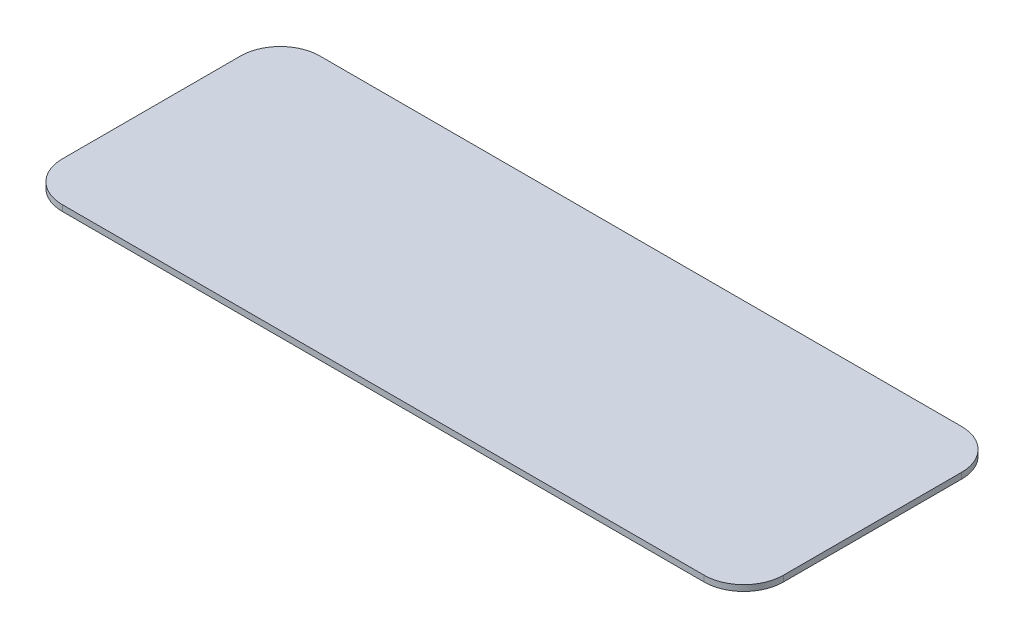
ISO-10303-21;
HEADER;
FILE_DESCRIPTION(('STEP AP214'),'2;1');
FILE_NAME('part.step','',(''),(''),'','','');
FILE_SCHEMA(('AUTOMOTIVE_DESIGN { 1 0 10303 214 1 1 1 1 }'));
ENDSEC;
DATA;
#1=APPLICATION_CONTEXT('core data for automotive mechanical design processes');
#2=APPLICATION_PROTOCOL_DEFINITION('international standard','automotive_design',2000,#1);
#3=PRODUCT_CONTEXT('',#1,'mechanical');
#4=PRODUCT('Part','Part','',(#3));
#5=PRODUCT_RELATED_PRODUCT_CATEGORY('part','',(#4));
#6=PRODUCT_DEFINITION_FORMATION('','',#4);
#7=PRODUCT_DEFINITION_CONTEXT('part definition',#1,'design');
#8=PRODUCT_DEFINITION('design','',#6,#7);
#9=PRODUCT_DEFINITION_SHAPE('','',#8);
#10=(LENGTH_UNIT() NAMED_UNIT(*) SI_UNIT(.MILLI.,.METRE.));
#11=(NAMED_UNIT(*) PLANE_ANGLE_UNIT() SI_UNIT($,.RADIAN.));
#12=(NAMED_UNIT(*) SI_UNIT($,.STERADIAN.) SOLID_ANGLE_UNIT());
#13=UNCERTAINTY_MEASURE_WITH_UNIT(LENGTH_MEASURE(1.E-05),#10,'distance_accuracy_value','');
#14=(GEOMETRIC_REPRESENTATION_CONTEXT(3) GLOBAL_UNCERTAINTY_ASSIGNED_CONTEXT((#13)) GLOBAL_UNIT_ASSIGNED_CONTEXT((#10,
#11,#12)) REPRESENTATION_CONTEXT('',''));
#15=CARTESIAN_POINT('',(0.,0.,0.));
#16=DIRECTION('',(0.,0.,1.));
#17=DIRECTION('',(1.,0.,0.));
#18=AXIS2_PLACEMENT_3D('',#15,#16,#17);
#19=CARTESIAN_POINT('',(-91.,1.5,32.5));
#20=DIRECTION('',(1.,0.,0.));
#21=DIRECTION('',(0.,0.,-1.));
#22=AXIS2_PLACEMENT_3D('',#19,#20,#21);
#23=PLANE('',#22);
#24=DIRECTION('',(0.,0.,1.));
#25=VECTOR('',#24,1.);
#26=CARTESIAN_POINT('',(-91.,1.5,32.5));
#27=LINE('',#26,#25);
#28=CARTESIAN_POINT('',(-91.,1.5,-22.5));
#29=VERTEX_POINT('',#28);
#30=CARTESIAN_POINT('',(-91.,1.5,22.5));
#31=VERTEX_POINT('',#30);
#32=EDGE_CURVE('E119',#29,#31,#27,.T.);
#33=ORIENTED_EDGE('',*,*,#32,.F.);
#34=DIRECTION('',(0.,-1.,0.));
#35=VECTOR('',#34,1.);
#36=CARTESIAN_POINT('',(-91.,1.5,-22.5));
#37=LINE('',#36,#35);
#38=CARTESIAN_POINT('',(-91.,0.,-22.5));
#39=VERTEX_POINT('',#38);
#40=EDGE_CURVE('E104',#29,#39,#37,.T.);
#41=ORIENTED_EDGE('',*,*,#40,.T.);
#42=DIRECTION('',(0.,0.,1.));
#43=VECTOR('',#42,1.);
#44=CARTESIAN_POINT('',(-91.,0.,32.5));
#45=LINE('',#44,#43);
#46=CARTESIAN_POINT('',(-91.,0.,22.5));
#47=VERTEX_POINT('',#46);
#48=EDGE_CURVE('E116',#39,#47,#45,.T.);
#49=ORIENTED_EDGE('',*,*,#48,.T.);
#50=DIRECTION('',(0.,-1.,0.));
#51=VECTOR('',#50,1.);
#52=CARTESIAN_POINT('',(-91.,1.5,22.5));
#53=LINE('',#52,#51);
#54=EDGE_CURVE('E121',#47,#31,#53,.F.);
#55=ORIENTED_EDGE('',*,*,#54,.T.);
#56=EDGE_LOOP('',(#33,#41,#49,#55));
#57=FACE_BOUND('',#56,.T.);
#58=ADVANCED_FACE('F34',(#57),#23,.F.);
#59=CARTESIAN_POINT('',(91.,1.5,32.5));
#60=DIRECTION('',(0.,0.,-1.));
#61=DIRECTION('',(-1.,0.,0.));
#62=AXIS2_PLACEMENT_3D('',#59,#60,#61);
#63=PLANE('',#62);
#64=DIRECTION('',(1.,0.,0.));
#65=VECTOR('',#64,1.);
#66=CARTESIAN_POINT('',(91.,0.,32.5));
#67=LINE('',#66,#65);
#68=CARTESIAN_POINT('',(-81.,0.,32.5));
#69=VERTEX_POINT('',#68);
#70=CARTESIAN_POINT('',(81.,0.,32.5));
#71=VERTEX_POINT('',#70);
#72=EDGE_CURVE('E125',#69,#71,#67,.T.);
#73=ORIENTED_EDGE('',*,*,#72,.T.);
#74=DIRECTION('',(0.,-1.,0.));
#75=VECTOR('',#74,1.);
#76=CARTESIAN_POINT('',(81.,1.5,32.5));
#77=LINE('',#76,#75);
#78=CARTESIAN_POINT('',(81.,1.5,32.5));
#79=VERTEX_POINT('',#78);
#80=EDGE_CURVE('E11',#71,#79,#77,.F.);
#81=ORIENTED_EDGE('',*,*,#80,.T.);
#82=DIRECTION('',(1.,0.,0.));
#83=VECTOR('',#82,1.);
#84=CARTESIAN_POINT('',(91.,1.5,32.5));
#85=LINE('',#84,#83);
#86=CARTESIAN_POINT('',(-81.,1.5,32.5));
#87=VERTEX_POINT('',#86);
#88=EDGE_CURVE('E161',#87,#79,#85,.T.);
#89=ORIENTED_EDGE('',*,*,#88,.F.);
#90=DIRECTION('',(0.,-1.,0.));
#91=VECTOR('',#90,1.);
#92=CARTESIAN_POINT('',(-81.,1.5,32.5));
#93=LINE('',#92,#91);
#94=EDGE_CURVE('E42',#87,#69,#93,.T.);
#95=ORIENTED_EDGE('',*,*,#94,.T.);
#96=EDGE_LOOP('',(#73,#81,#89,#95));
#97=FACE_BOUND('',#96,.T.);
#98=ADVANCED_FACE('F159',(#97),#63,.F.);
#99=CARTESIAN_POINT('',(91.,1.5,32.5));
#100=DIRECTION('',(-1.,0.,0.));
#101=DIRECTION('',(0.,0.,1.));
#102=AXIS2_PLACEMENT_3D('',#99,#100,#101);
#103=PLANE('',#102);
#104=DIRECTION('',(0.,0.,-1.));
#105=VECTOR('',#104,1.);
#106=CARTESIAN_POINT('',(91.,0.,32.5));
#107=LINE('',#106,#105);
#108=CARTESIAN_POINT('',(91.,0.,22.5));
#109=VERTEX_POINT('',#108);
#110=CARTESIAN_POINT('',(91.,0.,-22.5));
#111=VERTEX_POINT('',#110);
#112=EDGE_CURVE('E128',#109,#111,#107,.T.);
#113=ORIENTED_EDGE('',*,*,#112,.T.);
#114=DIRECTION('',(0.,-1.,0.));
#115=VECTOR('',#114,1.);
#116=CARTESIAN_POINT('',(91.,1.5,-22.5));
#117=LINE('',#116,#115);
#118=CARTESIAN_POINT('',(91.,1.5,-22.5));
#119=VERTEX_POINT('',#118);
#120=EDGE_CURVE('E49',#111,#119,#117,.F.);
#121=ORIENTED_EDGE('',*,*,#120,.T.);
#122=DIRECTION('',(0.,0.,-1.));
#123=VECTOR('',#122,1.);
#124=CARTESIAN_POINT('',(91.,1.5,32.5));
#125=LINE('',#124,#123);
#126=CARTESIAN_POINT('',(91.,1.5,22.5));
#127=VERTEX_POINT('',#126);
#128=EDGE_CURVE('E169',#127,#119,#125,.T.);
#129=ORIENTED_EDGE('',*,*,#128,.F.);
#130=DIRECTION('',(0.,-1.,0.));
#131=VECTOR('',#130,1.);
#132=CARTESIAN_POINT('',(91.,1.5,22.5));
#133=LINE('',#132,#131);
#134=EDGE_CURVE('E152',#127,#109,#133,.T.);
#135=ORIENTED_EDGE('',*,*,#134,.T.);
#136=EDGE_LOOP('',(#113,#121,#129,#135));
#137=FACE_BOUND('',#136,.T.);
#138=ADVANCED_FACE('F168',(#137),#103,.F.);
#139=CARTESIAN_POINT('',(91.,1.5,-32.5));
#140=DIRECTION('',(0.,0.,1.));
#141=DIRECTION('',(1.,0.,0.));
#142=AXIS2_PLACEMENT_3D('',#139,#140,#141);
#143=PLANE('',#142);
#144=DIRECTION('',(-1.,0.,0.));
#145=VECTOR('',#144,1.);
#146=CARTESIAN_POINT('',(91.,0.,-32.5));
#147=LINE('',#146,#145);
#148=CARTESIAN_POINT('',(81.,0.,-32.5));
#149=VERTEX_POINT('',#148);
#150=CARTESIAN_POINT('',(-81.,0.,-32.5));
#151=VERTEX_POINT('',#150);
#152=EDGE_CURVE('E135',#149,#151,#147,.T.);
#153=ORIENTED_EDGE('',*,*,#152,.T.);
#154=DIRECTION('',(0.,-1.,0.));
#155=VECTOR('',#154,1.);
#156=CARTESIAN_POINT('',(-81.,1.5,-32.5));
#157=LINE('',#156,#155);
#158=CARTESIAN_POINT('',(-81.,1.5,-32.5));
#159=VERTEX_POINT('',#158);
#160=EDGE_CURVE('E105',#151,#159,#157,.F.);
#161=ORIENTED_EDGE('',*,*,#160,.T.);
#162=DIRECTION('',(-1.,0.,0.));
#163=VECTOR('',#162,1.);
#164=CARTESIAN_POINT('',(91.,1.5,-32.5));
#165=LINE('',#164,#163);
#166=CARTESIAN_POINT('',(81.,1.5,-32.5));
#167=VERTEX_POINT('',#166);
#168=EDGE_CURVE('E131',#167,#159,#165,.T.);
#169=ORIENTED_EDGE('',*,*,#168,.F.);
#170=DIRECTION('',(0.,-1.,0.));
#171=VECTOR('',#170,1.);
#172=CARTESIAN_POINT('',(81.,1.5,-32.5));
#173=LINE('',#172,#171);
#174=EDGE_CURVE('E110',#167,#149,#173,.T.);
#175=ORIENTED_EDGE('',*,*,#174,.T.);
#176=EDGE_LOOP('',(#153,#161,#169,#175));
#177=FACE_BOUND('',#176,.T.);
#178=ADVANCED_FACE('F197',(#177),#143,.F.);
#179=CARTESIAN_POINT('',(0.,1.5,0.));
#180=DIRECTION('',(0.,1.,0.));
#181=DIRECTION('',(0.,0.,1.));
#182=AXIS2_PLACEMENT_3D('',#179,#180,#181);
#183=PLANE('',#182);
#184=ORIENTED_EDGE('',*,*,#168,.T.);
#185=CARTESIAN_POINT('',(-81.,1.5,-22.5));
#186=DIRECTION('',(0.,1.,0.));
#187=DIRECTION('',(0.,0.,1.));
#188=AXIS2_PLACEMENT_3D('',#185,#186,#187);
#189=CIRCLE('',#188,10.);
#190=EDGE_CURVE('E150',#159,#29,#189,.T.);
#191=ORIENTED_EDGE('',*,*,#190,.T.);
#192=ORIENTED_EDGE('',*,*,#32,.T.);
#193=CARTESIAN_POINT('',(-81.,1.5,22.5));
#194=DIRECTION('',(0.,1.,0.));
#195=DIRECTION('',(0.,0.,1.));
#196=AXIS2_PLACEMENT_3D('',#193,#194,#195);
#197=CIRCLE('',#196,10.);
#198=EDGE_CURVE('E145',#31,#87,#197,.T.);
#199=ORIENTED_EDGE('',*,*,#198,.T.);
#200=ORIENTED_EDGE('',*,*,#88,.T.);
#201=CARTESIAN_POINT('',(81.,1.5,22.5));
#202=DIRECTION('',(0.,1.,0.));
#203=DIRECTION('',(0.,0.,1.));
#204=AXIS2_PLACEMENT_3D('',#201,#202,#203);
#205=CIRCLE('',#204,10.);
#206=EDGE_CURVE('E56',#79,#127,#205,.T.);
#207=ORIENTED_EDGE('',*,*,#206,.T.);
#208=ORIENTED_EDGE('',*,*,#128,.T.);
#209=CARTESIAN_POINT('',(81.,1.5,-22.5));
#210=DIRECTION('',(0.,1.,0.));
#211=DIRECTION('',(0.,0.,1.));
#212=AXIS2_PLACEMENT_3D('',#209,#210,#211);
#213=CIRCLE('',#212,10.);
#214=EDGE_CURVE('E148',#119,#167,#213,.T.);
#215=ORIENTED_EDGE('',*,*,#214,.T.);
#216=EDGE_LOOP('',(#184,#191,#192,#199,#200,#207,#208,#215));
#217=FACE_BOUND('',#216,.T.);
#218=ADVANCED_FACE('F174',(#217),#183,.T.);
#219=CARTESIAN_POINT('',(0.,0.,0.));
#220=DIRECTION('',(0.,1.,0.));
#221=DIRECTION('',(0.,0.,1.));
#222=AXIS2_PLACEMENT_3D('',#219,#220,#221);
#223=PLANE('',#222);
#224=ORIENTED_EDGE('',*,*,#48,.F.);
#225=CARTESIAN_POINT('',(-81.,0.,-22.5));
#226=DIRECTION('',(0.,1.,0.));
#227=DIRECTION('',(0.,0.,1.));
#228=AXIS2_PLACEMENT_3D('',#225,#226,#227);
#229=CIRCLE('',#228,10.);
#230=EDGE_CURVE('E100',#39,#151,#229,.F.);
#231=ORIENTED_EDGE('',*,*,#230,.T.);
#232=ORIENTED_EDGE('',*,*,#152,.F.);
#233=CARTESIAN_POINT('',(81.,0.,-22.5));
#234=DIRECTION('',(0.,1.,0.));
#235=DIRECTION('',(0.,0.,1.));
#236=AXIS2_PLACEMENT_3D('',#233,#234,#235);
#237=CIRCLE('',#236,10.);
#238=EDGE_CURVE('E111',#149,#111,#237,.F.);
#239=ORIENTED_EDGE('',*,*,#238,.T.);
#240=ORIENTED_EDGE('',*,*,#112,.F.);
#241=CARTESIAN_POINT('',(81.,0.,22.5));
#242=DIRECTION('',(0.,1.,0.));
#243=DIRECTION('',(0.,0.,1.));
#244=AXIS2_PLACEMENT_3D('',#241,#242,#243);
#245=CIRCLE('',#244,10.);
#246=EDGE_CURVE('E139',#109,#71,#245,.F.);
#247=ORIENTED_EDGE('',*,*,#246,.T.);
#248=ORIENTED_EDGE('',*,*,#72,.F.);
#249=CARTESIAN_POINT('',(-81.,0.,22.5));
#250=DIRECTION('',(0.,1.,0.));
#251=DIRECTION('',(0.,0.,1.));
#252=AXIS2_PLACEMENT_3D('',#249,#250,#251);
#253=CIRCLE('',#252,10.);
#254=EDGE_CURVE('E120',#69,#47,#253,.F.);
#255=ORIENTED_EDGE('',*,*,#254,.T.);
#256=EDGE_LOOP('',(#224,#231,#232,#239,#240,#247,#248,#255));
#257=FACE_BOUND('',#256,.T.);
#258=ADVANCED_FACE('F123',(#257),#223,.F.);
#259=CARTESIAN_POINT('',(-81.,1.5,-22.5));
#260=DIRECTION('',(0.,-1.,0.));
#261=DIRECTION('',(0.,0.,-1.));
#262=AXIS2_PLACEMENT_3D('',#259,#260,#261);
#263=CYLINDRICAL_SURFACE('',#262,10.);
#264=ORIENTED_EDGE('',*,*,#190,.F.);
#265=ORIENTED_EDGE('',*,*,#160,.F.);
#266=ORIENTED_EDGE('',*,*,#230,.F.);
#267=ORIENTED_EDGE('',*,*,#40,.F.);
#268=EDGE_LOOP('',(#264,#265,#266,#267));
#269=FACE_BOUND('',#268,.T.);
#270=ADVANCED_FACE('F103',(#269),#263,.T.);
#271=CARTESIAN_POINT('',(81.,1.5,-22.5));
#272=DIRECTION('',(0.,-1.,0.));
#273=DIRECTION('',(0.,0.,-1.));
#274=AXIS2_PLACEMENT_3D('',#271,#272,#273);
#275=CYLINDRICAL_SURFACE('',#274,10.);
#276=ORIENTED_EDGE('',*,*,#214,.F.);
#277=ORIENTED_EDGE('',*,*,#120,.F.);
#278=ORIENTED_EDGE('',*,*,#238,.F.);
#279=ORIENTED_EDGE('',*,*,#174,.F.);
#280=EDGE_LOOP('',(#276,#277,#278,#279));
#281=FACE_BOUND('',#280,.T.);
#282=ADVANCED_FACE('F179',(#281),#275,.T.);
#283=CARTESIAN_POINT('',(81.,1.5,22.5));
#284=DIRECTION('',(0.,-1.,0.));
#285=DIRECTION('',(0.,0.,-1.));
#286=AXIS2_PLACEMENT_3D('',#283,#284,#285);
#287=CYLINDRICAL_SURFACE('',#286,10.);
#288=ORIENTED_EDGE('',*,*,#206,.F.);
#289=ORIENTED_EDGE('',*,*,#80,.F.);
#290=ORIENTED_EDGE('',*,*,#246,.F.);
#291=ORIENTED_EDGE('',*,*,#134,.F.);
#292=EDGE_LOOP('',(#288,#289,#290,#291));
#293=FACE_BOUND('',#292,.T.);
#294=ADVANCED_FACE('F167',(#293),#287,.T.);
#295=CARTESIAN_POINT('',(-81.,1.5,22.5));
#296=DIRECTION('',(0.,-1.,0.));
#297=DIRECTION('',(0.,0.,-1.));
#298=AXIS2_PLACEMENT_3D('',#295,#296,#297);
#299=CYLINDRICAL_SURFACE('',#298,10.);
#300=ORIENTED_EDGE('',*,*,#198,.F.);
#301=ORIENTED_EDGE('',*,*,#54,.F.);
#302=ORIENTED_EDGE('',*,*,#254,.F.);
#303=ORIENTED_EDGE('',*,*,#94,.F.);
#304=EDGE_LOOP('',(#300,#301,#302,#303));
#305=FACE_BOUND('',#304,.T.);
#306=ADVANCED_FACE('F36',(#305),#299,.T.);
#307=CLOSED_SHELL('',(#58,#98,#138,#178,#218,#258,#270,#282,#294,#306));
#308=MANIFOLD_SOLID_BREP('B2',#307);
#309=ADVANCED_BREP_SHAPE_REPRESENTATION('',(#18,#308),#14);
#310=SHAPE_DEFINITION_REPRESENTATION(#9,#309);
ENDSEC;
END-ISO-10303-21;
